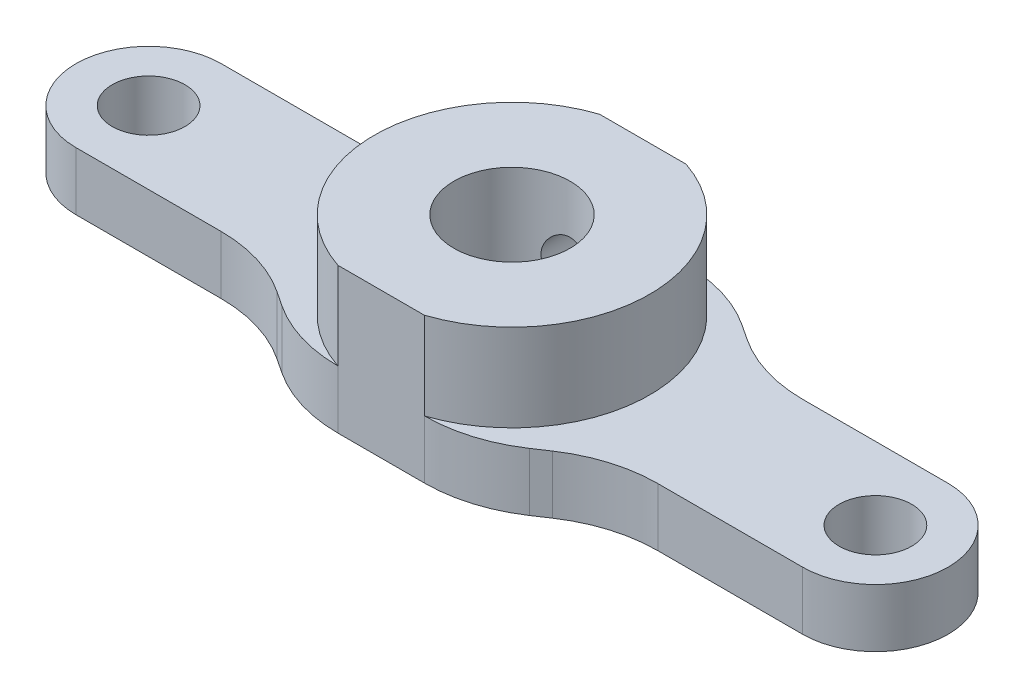
ISO-10303-21;
HEADER;
FILE_DESCRIPTION(('STEP AP214'),'2;1');
FILE_NAME('part.step','',(''),(''),'','','');
FILE_SCHEMA(('AUTOMOTIVE_DESIGN { 1 0 10303 214 1 1 1 1 }'));
ENDSEC;
DATA;
#1=APPLICATION_CONTEXT('core data for automotive mechanical design processes');
#2=APPLICATION_PROTOCOL_DEFINITION('international standard','automotive_design',2000,#1);
#3=PRODUCT_CONTEXT('',#1,'mechanical');
#4=PRODUCT('Part','Part','',(#3));
#5=PRODUCT_RELATED_PRODUCT_CATEGORY('part','',(#4));
#6=PRODUCT_DEFINITION_FORMATION('','',#4);
#7=PRODUCT_DEFINITION_CONTEXT('part definition',#1,'design');
#8=PRODUCT_DEFINITION('design','',#6,#7);
#9=PRODUCT_DEFINITION_SHAPE('','',#8);
#10=(LENGTH_UNIT() NAMED_UNIT(*) SI_UNIT(.MILLI.,.METRE.));
#11=(NAMED_UNIT(*) PLANE_ANGLE_UNIT() SI_UNIT($,.RADIAN.));
#12=(NAMED_UNIT(*) SI_UNIT($,.STERADIAN.) SOLID_ANGLE_UNIT());
#13=UNCERTAINTY_MEASURE_WITH_UNIT(LENGTH_MEASURE(1.E-05),#10,'distance_accuracy_value','');
#14=(GEOMETRIC_REPRESENTATION_CONTEXT(3) GLOBAL_UNCERTAINTY_ASSIGNED_CONTEXT((#13)) GLOBAL_UNIT_ASSIGNED_CONTEXT((#10,
#11,#12)) REPRESENTATION_CONTEXT('',''));
#15=CARTESIAN_POINT('',(0.,0.,0.));
#16=DIRECTION('',(0.,0.,1.));
#17=DIRECTION('',(1.,0.,0.));
#18=AXIS2_PLACEMENT_3D('',#15,#16,#17);
#19=CARTESIAN_POINT('',(0.,4.,0.));
#20=DIRECTION('',(0.,1.,0.));
#21=DIRECTION('',(0.,0.,1.));
#22=AXIS2_PLACEMENT_3D('',#19,#20,#21);
#23=PLANE('',#22);
#24=CARTESIAN_POINT('',(-25.,4.,0.));
#25=DIRECTION('',(0.,1.,0.));
#26=DIRECTION('',(0.,0.,1.));
#27=AXIS2_PLACEMENT_3D('',#24,#25,#26);
#28=CIRCLE('',#27,9.47809222114672);
#29=CARTESIAN_POINT('',(-27.97224362268,4.,-9.));
#30=VERTEX_POINT('',#29);
#31=CARTESIAN_POINT('',(-27.97224362268,4.,9.00000000000001));
#32=VERTEX_POINT('',#31);
#33=EDGE_CURVE('E151',#30,#32,#28,.T.);
#34=ORIENTED_EDGE('',*,*,#33,.F.);
#35=CARTESIAN_POINT('',(-27.9722436226801,4.,1.));
#36=DIRECTION('',(0.,1.,0.));
#37=DIRECTION('',(0.,0.,1.));
#38=AXIS2_PLACEMENT_3D('',#35,#36,#37);
#39=CIRCLE('',#38,10.);
#40=CARTESIAN_POINT('',(-33.5192455849324,4.,-7.32050294337842));
#41=VERTEX_POINT('',#40);
#42=EDGE_CURVE('E327',#30,#41,#39,.T.);
#43=ORIENTED_EDGE('',*,*,#42,.T.);
#44=DIRECTION('',(-0.832050294337843,0.,0.55470019622523));
#45=VECTOR('',#44,1.);
#46=CARTESIAN_POINT('',(-13.6923076923077,4.,-20.5384615384615));
#47=LINE('',#46,#45);
#48=CARTESIAN_POINT('',(-34.4807544150676,4.,-6.67949705662159));
#49=VERTEX_POINT('',#48);
#50=EDGE_CURVE('E390',#41,#49,#47,.T.);
#51=ORIENTED_EDGE('',*,*,#50,.T.);
#52=CARTESIAN_POINT('',(-40.0277563773199,4.,-15.));
#53=DIRECTION('',(0.,1.,0.));
#54=DIRECTION('',(0.,0.,1.));
#55=AXIS2_PLACEMENT_3D('',#52,#53,#54);
#56=CIRCLE('',#55,10.);
#57=CARTESIAN_POINT('',(-40.0277563773199,4.,-4.99999999999999));
#58=VERTEX_POINT('',#57);
#59=EDGE_CURVE('E411',#49,#58,#56,.F.);
#60=ORIENTED_EDGE('',*,*,#59,.T.);
#61=DIRECTION('',(-1.,0.,0.));
#62=VECTOR('',#61,1.);
#63=CARTESIAN_POINT('',(0.,4.,-5.));
#64=LINE('',#63,#62);
#65=CARTESIAN_POINT('',(-50.,4.,-4.99999999999999));
#66=VERTEX_POINT('',#65);
#67=EDGE_CURVE('E217',#58,#66,#64,.T.);
#68=ORIENTED_EDGE('',*,*,#67,.T.);
#69=CARTESIAN_POINT('',(-50.,4.,0.));
#70=DIRECTION('',(0.,1.,0.));
#71=DIRECTION('',(0.,0.,1.));
#72=AXIS2_PLACEMENT_3D('',#69,#70,#71);
#73=CIRCLE('',#72,5.);
#74=CARTESIAN_POINT('',(-50.,4.,5.00000000000001));
#75=VERTEX_POINT('',#74);
#76=EDGE_CURVE('E410',#66,#75,#73,.T.);
#77=ORIENTED_EDGE('',*,*,#76,.T.);
#78=DIRECTION('',(-1.,0.,0.));
#79=VECTOR('',#78,1.);
#80=CARTESIAN_POINT('',(0.,4.,5.));
#81=LINE('',#80,#79);
#82=CARTESIAN_POINT('',(-40.0277563773199,4.,5.00000000000001));
#83=VERTEX_POINT('',#82);
#84=EDGE_CURVE('E415',#83,#75,#81,.T.);
#85=ORIENTED_EDGE('',*,*,#84,.F.);
#86=CARTESIAN_POINT('',(-40.0277563773199,4.,15.));
#87=DIRECTION('',(0.,1.,0.));
#88=DIRECTION('',(0.,0.,1.));
#89=AXIS2_PLACEMENT_3D('',#86,#87,#88);
#90=CIRCLE('',#89,10.);
#91=CARTESIAN_POINT('',(-34.4807544150676,4.,6.67949705662159));
#92=VERTEX_POINT('',#91);
#93=EDGE_CURVE('E423',#92,#83,#90,.T.);
#94=ORIENTED_EDGE('',*,*,#93,.F.);
#95=DIRECTION('',(-0.832050294337843,0.,-0.55470019622523));
#96=VECTOR('',#95,1.);
#97=CARTESIAN_POINT('',(-13.6923076923077,4.,20.5384615384615));
#98=LINE('',#97,#96);
#99=CARTESIAN_POINT('',(-33.5192455849323,4.,7.32050294337843));
#100=VERTEX_POINT('',#99);
#101=EDGE_CURVE('E428',#100,#92,#98,.T.);
#102=ORIENTED_EDGE('',*,*,#101,.F.);
#103=CARTESIAN_POINT('',(-27.97224362268,4.,-0.999999999999997));
#104=DIRECTION('',(0.,1.,0.));
#105=DIRECTION('',(0.,0.,1.));
#106=AXIS2_PLACEMENT_3D('',#103,#104,#105);
#107=CIRCLE('',#106,10.);
#108=EDGE_CURVE('E432',#32,#100,#107,.F.);
#109=ORIENTED_EDGE('',*,*,#108,.F.);
#110=EDGE_LOOP('',(#34,#43,#51,#60,#68,#77,#85,#94,#102,#109));
#111=FACE_BOUND('',#110,.T.);
#112=CARTESIAN_POINT('',(-50.,4.,0.));
#113=DIRECTION('',(0.,1.,0.));
#114=DIRECTION('',(0.,0.,1.));
#115=AXIS2_PLACEMENT_3D('',#112,#113,#114);
#116=CIRCLE('',#115,2.5);
#117=CARTESIAN_POINT('',(-50.,4.,2.50000000000001));
#118=VERTEX_POINT('',#117);
#119=EDGE_CURVE('E243',#118,#118,#116,.T.);
#120=ORIENTED_EDGE('',*,*,#119,.F.);
#121=EDGE_LOOP('',(#120));
#122=FACE_BOUND('',#121,.T.);
#123=ADVANCED_FACE('F48',(#111,#122),#23,.T.);
#124=CARTESIAN_POINT('',(0.,4.,-9.));
#125=DIRECTION('',(0.,0.,-1.));
#126=DIRECTION('',(-1.,0.,0.));
#127=AXIS2_PLACEMENT_3D('',#124,#125,#126);
#128=PLANE('',#127);
#129=CARTESIAN_POINT('',(-25.,5.,-9.));
#130=DIRECTION('',(0.,0.,-1.));
#131=DIRECTION('',(-1.,0.,0.));
#132=AXIS2_PLACEMENT_3D('',#129,#130,#131);
#133=CIRCLE('',#132,1.65);
#134=CARTESIAN_POINT('',(-26.65,5.,-9.));
#135=VERTEX_POINT('',#134);
#136=EDGE_CURVE('E532',#135,#135,#133,.T.);
#137=ORIENTED_EDGE('',*,*,#136,.F.);
#138=EDGE_LOOP('',(#137));
#139=FACE_BOUND('',#138,.T.);
#140=DIRECTION('',(1.,0.,0.));
#141=VECTOR('',#140,1.);
#142=CARTESIAN_POINT('',(0.,0.,-9.));
#143=LINE('',#142,#141);
#144=CARTESIAN_POINT('',(-27.97224362268,0.,-9.));
#145=VERTEX_POINT('',#144);
#146=CARTESIAN_POINT('',(-22.02775637732,0.,-9.));
#147=VERTEX_POINT('',#146);
#148=EDGE_CURVE('E251',#145,#147,#143,.T.);
#149=ORIENTED_EDGE('',*,*,#148,.F.);
#150=DIRECTION('',(0.,-1.,0.));
#151=VECTOR('',#150,1.);
#152=CARTESIAN_POINT('',(-27.97224362268,4.,-9.));
#153=LINE('',#152,#151);
#154=EDGE_CURVE('E11',#30,#145,#153,.T.);
#155=ORIENTED_EDGE('',*,*,#154,.F.);
#156=DIRECTION('',(0.,-1.,0.));
#157=VECTOR('',#156,1.);
#158=CARTESIAN_POINT('',(-27.97224362268,10.,-9.));
#159=LINE('',#158,#157);
#160=CARTESIAN_POINT('',(-27.97224362268,10.,-9.));
#161=VERTEX_POINT('',#160);
#162=EDGE_CURVE('E487',#161,#30,#159,.T.);
#163=ORIENTED_EDGE('',*,*,#162,.F.);
#164=DIRECTION('',(-1.,0.,0.));
#165=VECTOR('',#164,1.);
#166=CARTESIAN_POINT('',(0.,10.,-9.));
#167=LINE('',#166,#165);
#168=CARTESIAN_POINT('',(-22.02775637732,10.,-9.));
#169=VERTEX_POINT('',#168);
#170=EDGE_CURVE('E502',#169,#161,#167,.T.);
#171=ORIENTED_EDGE('',*,*,#170,.F.);
#172=DIRECTION('',(0.,-1.,0.));
#173=VECTOR('',#172,1.);
#174=CARTESIAN_POINT('',(-22.02775637732,10.,-9.));
#175=LINE('',#174,#173);
#176=CARTESIAN_POINT('',(-22.02775637732,4.,-9.));
#177=VERTEX_POINT('',#176);
#178=EDGE_CURVE('E483',#169,#177,#175,.T.);
#179=ORIENTED_EDGE('',*,*,#178,.T.);
#180=DIRECTION('',(0.,-1.,0.));
#181=VECTOR('',#180,1.);
#182=CARTESIAN_POINT('',(-22.02775637732,4.,-9.));
#183=LINE('',#182,#181);
#184=EDGE_CURVE('E142',#177,#147,#183,.T.);
#185=ORIENTED_EDGE('',*,*,#184,.T.);
#186=EDGE_LOOP('',(#149,#155,#163,#171,#179,#185));
#187=FACE_BOUND('',#186,.T.);
#188=ADVANCED_FACE('F50',(#139,#187),#128,.T.);
#189=CARTESIAN_POINT('',(-27.9722436226801,4.,1.));
#190=DIRECTION('',(0.,-1.,0.));
#191=DIRECTION('',(0.,0.,-1.));
#192=AXIS2_PLACEMENT_3D('',#189,#190,#191);
#193=CYLINDRICAL_SURFACE('',#192,10.);
#194=CARTESIAN_POINT('',(-27.9722436226801,0.,1.));
#195=DIRECTION('',(0.,1.,0.));
#196=DIRECTION('',(0.,0.,1.));
#197=AXIS2_PLACEMENT_3D('',#194,#195,#196);
#198=CIRCLE('',#197,10.);
#199=CARTESIAN_POINT('',(-33.5192455849324,0.,-7.32050294337842));
#200=VERTEX_POINT('',#199);
#201=EDGE_CURVE('E254',#145,#200,#198,.T.);
#202=ORIENTED_EDGE('',*,*,#201,.T.);
#203=DIRECTION('',(0.,-1.,0.));
#204=VECTOR('',#203,1.);
#205=CARTESIAN_POINT('',(-33.5192455849324,4.,-7.32050294337842));
#206=LINE('',#205,#204);
#207=EDGE_CURVE('E64',#41,#200,#206,.T.);
#208=ORIENTED_EDGE('',*,*,#207,.F.);
#209=ORIENTED_EDGE('',*,*,#42,.F.);
#210=ORIENTED_EDGE('',*,*,#154,.T.);
#211=EDGE_LOOP('',(#202,#208,#209,#210));
#212=FACE_BOUND('',#211,.T.);
#213=ADVANCED_FACE('F543',(#212),#193,.T.);
#214=CARTESIAN_POINT('',(-13.6923076923077,4.,-20.5384615384615));
#215=DIRECTION('',(0.55470019622523,0.,0.832050294337843));
#216=DIRECTION('',(0.832050294337843,0.,-0.55470019622523));
#217=AXIS2_PLACEMENT_3D('',#214,#215,#216);
#218=PLANE('',#217);
#219=DIRECTION('',(-0.832050294337843,0.,0.55470019622523));
#220=VECTOR('',#219,1.);
#221=CARTESIAN_POINT('',(-13.6923076923077,0.,-20.5384615384615));
#222=LINE('',#221,#220);
#223=CARTESIAN_POINT('',(-34.4807544150676,0.,-6.67949705662159));
#224=VERTEX_POINT('',#223);
#225=EDGE_CURVE('E258',#200,#224,#222,.T.);
#226=ORIENTED_EDGE('',*,*,#225,.T.);
#227=DIRECTION('',(0.,-1.,0.));
#228=VECTOR('',#227,1.);
#229=CARTESIAN_POINT('',(-34.4807544150676,4.,-6.67949705662159));
#230=LINE('',#229,#228);
#231=EDGE_CURVE('E377',#49,#224,#230,.T.);
#232=ORIENTED_EDGE('',*,*,#231,.F.);
#233=ORIENTED_EDGE('',*,*,#50,.F.);
#234=ORIENTED_EDGE('',*,*,#207,.T.);
#235=EDGE_LOOP('',(#226,#232,#233,#234));
#236=FACE_BOUND('',#235,.T.);
#237=ADVANCED_FACE('F388',(#236),#218,.F.);
#238=CARTESIAN_POINT('',(-40.0277563773199,4.,-15.));
#239=DIRECTION('',(0.,-1.,0.));
#240=DIRECTION('',(0.,0.,-1.));
#241=AXIS2_PLACEMENT_3D('',#238,#239,#240);
#242=CYLINDRICAL_SURFACE('',#241,10.);
#243=CARTESIAN_POINT('',(-40.0277563773199,0.,-15.));
#244=DIRECTION('',(0.,1.,0.));
#245=DIRECTION('',(0.,0.,1.));
#246=AXIS2_PLACEMENT_3D('',#243,#244,#245);
#247=CIRCLE('',#246,10.);
#248=CARTESIAN_POINT('',(-40.0277563773199,0.,-4.99999999999999));
#249=VERTEX_POINT('',#248);
#250=EDGE_CURVE('E261',#224,#249,#247,.F.);
#251=ORIENTED_EDGE('',*,*,#250,.T.);
#252=DIRECTION('',(0.,-1.,0.));
#253=VECTOR('',#252,1.);
#254=CARTESIAN_POINT('',(-40.0277563773199,4.,-4.99999999999999));
#255=LINE('',#254,#253);
#256=EDGE_CURVE('E373',#58,#249,#255,.T.);
#257=ORIENTED_EDGE('',*,*,#256,.F.);
#258=ORIENTED_EDGE('',*,*,#59,.F.);
#259=ORIENTED_EDGE('',*,*,#231,.T.);
#260=EDGE_LOOP('',(#251,#257,#258,#259));
#261=FACE_BOUND('',#260,.T.);
#262=ADVANCED_FACE('F402',(#261),#242,.F.);
#263=CARTESIAN_POINT('',(0.,4.,-5.));
#264=DIRECTION('',(0.,0.,1.));
#265=DIRECTION('',(1.,0.,0.));
#266=AXIS2_PLACEMENT_3D('',#263,#264,#265);
#267=PLANE('',#266);
#268=DIRECTION('',(-1.,0.,0.));
#269=VECTOR('',#268,1.);
#270=CARTESIAN_POINT('',(0.,0.,-5.));
#271=LINE('',#270,#269);
#272=CARTESIAN_POINT('',(-50.,0.,-4.99999999999999));
#273=VERTEX_POINT('',#272);
#274=EDGE_CURVE('E264',#249,#273,#271,.T.);
#275=ORIENTED_EDGE('',*,*,#274,.T.);
#276=DIRECTION('',(0.,-1.,0.));
#277=VECTOR('',#276,1.);
#278=CARTESIAN_POINT('',(-50.,4.,-4.99999999999999));
#279=LINE('',#278,#277);
#280=EDGE_CURVE('E369',#66,#273,#279,.T.);
#281=ORIENTED_EDGE('',*,*,#280,.F.);
#282=ORIENTED_EDGE('',*,*,#67,.F.);
#283=ORIENTED_EDGE('',*,*,#256,.T.);
#284=EDGE_LOOP('',(#275,#281,#282,#283));
#285=FACE_BOUND('',#284,.T.);
#286=ADVANCED_FACE('F406',(#285),#267,.F.);
#287=CARTESIAN_POINT('',(-50.,4.,0.));
#288=DIRECTION('',(0.,-1.,0.));
#289=DIRECTION('',(0.,0.,-1.));
#290=AXIS2_PLACEMENT_3D('',#287,#288,#289);
#291=CYLINDRICAL_SURFACE('',#290,5.);
#292=CARTESIAN_POINT('',(-50.,0.,0.));
#293=DIRECTION('',(0.,1.,0.));
#294=DIRECTION('',(0.,0.,1.));
#295=AXIS2_PLACEMENT_3D('',#292,#293,#294);
#296=CIRCLE('',#295,5.);
#297=CARTESIAN_POINT('',(-50.,0.,5.00000000000001));
#298=VERTEX_POINT('',#297);
#299=EDGE_CURVE('E267',#273,#298,#296,.T.);
#300=ORIENTED_EDGE('',*,*,#299,.T.);
#301=DIRECTION('',(0.,-1.,0.));
#302=VECTOR('',#301,1.);
#303=CARTESIAN_POINT('',(-50.,4.,5.00000000000001));
#304=LINE('',#303,#302);
#305=EDGE_CURVE('E366',#75,#298,#304,.T.);
#306=ORIENTED_EDGE('',*,*,#305,.F.);
#307=ORIENTED_EDGE('',*,*,#76,.F.);
#308=ORIENTED_EDGE('',*,*,#280,.T.);
#309=EDGE_LOOP('',(#300,#306,#307,#308));
#310=FACE_BOUND('',#309,.T.);
#311=ADVANCED_FACE('F599',(#310),#291,.T.);
#312=CARTESIAN_POINT('',(0.,4.,5.));
#313=DIRECTION('',(0.,0.,1.));
#314=DIRECTION('',(1.,0.,0.));
#315=AXIS2_PLACEMENT_3D('',#312,#313,#314);
#316=PLANE('',#315);
#317=DIRECTION('',(-1.,0.,0.));
#318=VECTOR('',#317,1.);
#319=CARTESIAN_POINT('',(0.,0.,5.));
#320=LINE('',#319,#318);
#321=CARTESIAN_POINT('',(-40.0277563773199,0.,5.00000000000001));
#322=VERTEX_POINT('',#321);
#323=EDGE_CURVE('E271',#322,#298,#320,.T.);
#324=ORIENTED_EDGE('',*,*,#323,.F.);
#325=DIRECTION('',(0.,-1.,0.));
#326=VECTOR('',#325,1.);
#327=CARTESIAN_POINT('',(-40.0277563773199,4.,5.00000000000001));
#328=LINE('',#327,#326);
#329=EDGE_CURVE('E363',#83,#322,#328,.T.);
#330=ORIENTED_EDGE('',*,*,#329,.F.);
#331=ORIENTED_EDGE('',*,*,#84,.T.);
#332=ORIENTED_EDGE('',*,*,#305,.T.);
#333=EDGE_LOOP('',(#324,#330,#331,#332));
#334=FACE_BOUND('',#333,.T.);
#335=ADVANCED_FACE('F596',(#334),#316,.T.);
#336=CARTESIAN_POINT('',(-40.0277563773199,4.,15.));
#337=DIRECTION('',(0.,-1.,0.));
#338=DIRECTION('',(0.,0.,-1.));
#339=AXIS2_PLACEMENT_3D('',#336,#337,#338);
#340=CYLINDRICAL_SURFACE('',#339,10.);
#341=CARTESIAN_POINT('',(-40.0277563773199,0.,15.));
#342=DIRECTION('',(0.,1.,0.));
#343=DIRECTION('',(0.,0.,1.));
#344=AXIS2_PLACEMENT_3D('',#341,#342,#343);
#345=CIRCLE('',#344,10.);
#346=CARTESIAN_POINT('',(-34.4807544150676,0.,6.67949705662159));
#347=VERTEX_POINT('',#346);
#348=EDGE_CURVE('E275',#347,#322,#345,.T.);
#349=ORIENTED_EDGE('',*,*,#348,.F.);
#350=DIRECTION('',(0.,-1.,0.));
#351=VECTOR('',#350,1.);
#352=CARTESIAN_POINT('',(-34.4807544150676,4.,6.67949705662159));
#353=LINE('',#352,#351);
#354=EDGE_CURVE('E360',#92,#347,#353,.T.);
#355=ORIENTED_EDGE('',*,*,#354,.F.);
#356=ORIENTED_EDGE('',*,*,#93,.T.);
#357=ORIENTED_EDGE('',*,*,#329,.T.);
#358=EDGE_LOOP('',(#349,#355,#356,#357));
#359=FACE_BOUND('',#358,.T.);
#360=ADVANCED_FACE('F592',(#359),#340,.F.);
#361=CARTESIAN_POINT('',(-13.6923076923077,4.,20.5384615384615));
#362=DIRECTION('',(-0.55470019622523,0.,0.832050294337843));
#363=DIRECTION('',(0.832050294337843,0.,0.55470019622523));
#364=AXIS2_PLACEMENT_3D('',#361,#362,#363);
#365=PLANE('',#364);
#366=DIRECTION('',(-0.832050294337843,0.,-0.55470019622523));
#367=VECTOR('',#366,1.);
#368=CARTESIAN_POINT('',(-13.6923076923077,0.,20.5384615384615));
#369=LINE('',#368,#367);
#370=CARTESIAN_POINT('',(-33.5192455849323,0.,7.32050294337843));
#371=VERTEX_POINT('',#370);
#372=EDGE_CURVE('E280',#371,#347,#369,.T.);
#373=ORIENTED_EDGE('',*,*,#372,.F.);
#374=DIRECTION('',(0.,-1.,0.));
#375=VECTOR('',#374,1.);
#376=CARTESIAN_POINT('',(-33.5192455849323,4.,7.32050294337843));
#377=LINE('',#376,#375);
#378=EDGE_CURVE('E357',#100,#371,#377,.T.);
#379=ORIENTED_EDGE('',*,*,#378,.F.);
#380=ORIENTED_EDGE('',*,*,#101,.T.);
#381=ORIENTED_EDGE('',*,*,#354,.T.);
#382=EDGE_LOOP('',(#373,#379,#380,#381));
#383=FACE_BOUND('',#382,.T.);
#384=ADVANCED_FACE('F588',(#383),#365,.T.);
#385=CARTESIAN_POINT('',(-27.97224362268,4.,-0.999999999999997));
#386=DIRECTION('',(0.,-1.,0.));
#387=DIRECTION('',(0.,0.,-1.));
#388=AXIS2_PLACEMENT_3D('',#385,#386,#387);
#389=CYLINDRICAL_SURFACE('',#388,10.);
#390=CARTESIAN_POINT('',(-27.97224362268,0.,-0.999999999999997));
#391=DIRECTION('',(0.,1.,0.));
#392=DIRECTION('',(0.,0.,1.));
#393=AXIS2_PLACEMENT_3D('',#390,#391,#392);
#394=CIRCLE('',#393,10.);
#395=CARTESIAN_POINT('',(-27.97224362268,0.,9.00000000000001));
#396=VERTEX_POINT('',#395);
#397=EDGE_CURVE('E284',#396,#371,#394,.F.);
#398=ORIENTED_EDGE('',*,*,#397,.F.);
#399=DIRECTION('',(0.,-1.,0.));
#400=VECTOR('',#399,1.);
#401=CARTESIAN_POINT('',(-27.97224362268,4.,9.00000000000001));
#402=LINE('',#401,#400);
#403=EDGE_CURVE('E354',#32,#396,#402,.T.);
#404=ORIENTED_EDGE('',*,*,#403,.F.);
#405=ORIENTED_EDGE('',*,*,#108,.T.);
#406=ORIENTED_EDGE('',*,*,#378,.T.);
#407=EDGE_LOOP('',(#398,#404,#405,#406));
#408=FACE_BOUND('',#407,.T.);
#409=ADVANCED_FACE('F584',(#408),#389,.T.);
#410=CARTESIAN_POINT('',(0.,4.,9.00000000000001));
#411=DIRECTION('',(0.,0.,-1.));
#412=DIRECTION('',(-1.,0.,0.));
#413=AXIS2_PLACEMENT_3D('',#410,#411,#412);
#414=PLANE('',#413);
#415=DIRECTION('',(1.,0.,0.));
#416=VECTOR('',#415,1.);
#417=CARTESIAN_POINT('',(0.,0.,9.00000000000001));
#418=LINE('',#417,#416);
#419=CARTESIAN_POINT('',(-22.02775637732,0.,9.00000000000001));
#420=VERTEX_POINT('',#419);
#421=EDGE_CURVE('E288',#396,#420,#418,.T.);
#422=ORIENTED_EDGE('',*,*,#421,.T.);
#423=DIRECTION('',(0.,-1.,0.));
#424=VECTOR('',#423,1.);
#425=CARTESIAN_POINT('',(-22.02775637732,4.,9.00000000000001));
#426=LINE('',#425,#424);
#427=CARTESIAN_POINT('',(-22.02775637732,4.,9.00000000000001));
#428=VERTEX_POINT('',#427);
#429=EDGE_CURVE('E350',#428,#420,#426,.T.);
#430=ORIENTED_EDGE('',*,*,#429,.F.);
#431=DIRECTION('',(0.,-1.,0.));
#432=VECTOR('',#431,1.);
#433=CARTESIAN_POINT('',(-22.0277563773199,10.,9.00000000000001));
#434=LINE('',#433,#432);
#435=CARTESIAN_POINT('',(-22.0277563773199,10.,9.00000000000001));
#436=VERTEX_POINT('',#435);
#437=EDGE_CURVE('E255',#436,#428,#434,.T.);
#438=ORIENTED_EDGE('',*,*,#437,.F.);
#439=DIRECTION('',(1.,0.,0.));
#440=VECTOR('',#439,1.);
#441=CARTESIAN_POINT('',(0.,10.,9.00000000000001));
#442=LINE('',#441,#440);
#443=CARTESIAN_POINT('',(-27.97224362268,10.,9.00000000000001));
#444=VERTEX_POINT('',#443);
#445=EDGE_CURVE('E512',#444,#436,#442,.T.);
#446=ORIENTED_EDGE('',*,*,#445,.F.);
#447=DIRECTION('',(0.,-1.,0.));
#448=VECTOR('',#447,1.);
#449=CARTESIAN_POINT('',(-27.97224362268,10.,9.00000000000001));
#450=LINE('',#449,#448);
#451=EDGE_CURVE('E492',#444,#32,#450,.T.);
#452=ORIENTED_EDGE('',*,*,#451,.T.);
#453=ORIENTED_EDGE('',*,*,#403,.T.);
#454=EDGE_LOOP('',(#422,#430,#438,#446,#452,#453));
#455=FACE_BOUND('',#454,.T.);
#456=ADVANCED_FACE('F567',(#455),#414,.F.);
#457=CARTESIAN_POINT('',(-22.0277563773199,4.,-0.999999999999998));
#458=DIRECTION('',(0.,-1.,0.));
#459=DIRECTION('',(0.,0.,-1.));
#460=AXIS2_PLACEMENT_3D('',#457,#458,#459);
#461=CYLINDRICAL_SURFACE('',#460,10.);
#462=CARTESIAN_POINT('',(-22.0277563773199,0.,-0.999999999999998));
#463=DIRECTION('',(0.,1.,0.));
#464=DIRECTION('',(0.,0.,1.));
#465=AXIS2_PLACEMENT_3D('',#462,#463,#464);
#466=CIRCLE('',#465,10.);
#467=CARTESIAN_POINT('',(-16.4807544150676,0.,7.32050294337842));
#468=VERTEX_POINT('',#467);
#469=EDGE_CURVE('E291',#420,#468,#466,.T.);
#470=ORIENTED_EDGE('',*,*,#469,.T.);
#471=DIRECTION('',(0.,-1.,0.));
#472=VECTOR('',#471,1.);
#473=CARTESIAN_POINT('',(-16.4807544150676,4.,7.32050294337842));
#474=LINE('',#473,#472);
#475=CARTESIAN_POINT('',(-16.4807544150676,4.,7.32050294337842));
#476=VERTEX_POINT('',#475);
#477=EDGE_CURVE('E346',#476,#468,#474,.T.);
#478=ORIENTED_EDGE('',*,*,#477,.F.);
#479=CARTESIAN_POINT('',(-22.0277563773199,4.,-0.999999999999998));
#480=DIRECTION('',(0.,1.,0.));
#481=DIRECTION('',(0.,0.,1.));
#482=AXIS2_PLACEMENT_3D('',#479,#480,#481);
#483=CIRCLE('',#482,10.);
#484=EDGE_CURVE('E436',#428,#476,#483,.T.);
#485=ORIENTED_EDGE('',*,*,#484,.F.);
#486=ORIENTED_EDGE('',*,*,#429,.T.);
#487=EDGE_LOOP('',(#470,#478,#485,#486));
#488=FACE_BOUND('',#487,.T.);
#489=ADVANCED_FACE('F573',(#488),#461,.T.);
#490=CARTESIAN_POINT('',(-1.69230769230769,4.,-2.53846153846153));
#491=DIRECTION('',(-0.554700196225229,0.,-0.832050294337844));
#492=DIRECTION('',(-0.832050294337844,0.,0.554700196225229));
#493=AXIS2_PLACEMENT_3D('',#490,#491,#492);
#494=PLANE('',#493);
#495=DIRECTION('',(0.832050294337844,0.,-0.554700196225229));
#496=VECTOR('',#495,1.);
#497=CARTESIAN_POINT('',(-1.69230769230769,0.,-2.53846153846153));
#498=LINE('',#497,#496);
#499=CARTESIAN_POINT('',(-15.5192455849324,0.,6.67949705662159));
#500=VERTEX_POINT('',#499);
#501=EDGE_CURVE('E294',#468,#500,#498,.T.);
#502=ORIENTED_EDGE('',*,*,#501,.T.);
#503=DIRECTION('',(0.,-1.,0.));
#504=VECTOR('',#503,1.);
#505=CARTESIAN_POINT('',(-15.5192455849324,4.,6.67949705662159));
#506=LINE('',#505,#504);
#507=CARTESIAN_POINT('',(-15.5192455849324,4.,6.67949705662159));
#508=VERTEX_POINT('',#507);
#509=EDGE_CURVE('E342',#508,#500,#506,.T.);
#510=ORIENTED_EDGE('',*,*,#509,.F.);
#511=DIRECTION('',(0.832050294337844,0.,-0.554700196225229));
#512=VECTOR('',#511,1.);
#513=CARTESIAN_POINT('',(-1.69230769230769,4.,-2.53846153846153));
#514=LINE('',#513,#512);
#515=EDGE_CURVE('E439',#476,#508,#514,.T.);
#516=ORIENTED_EDGE('',*,*,#515,.F.);
#517=ORIENTED_EDGE('',*,*,#477,.T.);
#518=EDGE_LOOP('',(#502,#510,#516,#517));
#519=FACE_BOUND('',#518,.T.);
#520=ADVANCED_FACE('F577',(#519),#494,.F.);
#521=CARTESIAN_POINT('',(-9.97224362268005,4.,15.));
#522=DIRECTION('',(0.,-1.,0.));
#523=DIRECTION('',(0.,0.,-1.));
#524=AXIS2_PLACEMENT_3D('',#521,#522,#523);
#525=CYLINDRICAL_SURFACE('',#524,10.);
#526=CARTESIAN_POINT('',(-9.97224362268005,0.,15.));
#527=DIRECTION('',(0.,1.,0.));
#528=DIRECTION('',(0.,0.,1.));
#529=AXIS2_PLACEMENT_3D('',#526,#527,#528);
#530=CIRCLE('',#529,10.);
#531=CARTESIAN_POINT('',(-9.97224362268005,0.,5.));
#532=VERTEX_POINT('',#531);
#533=EDGE_CURVE('E297',#500,#532,#530,.F.);
#534=ORIENTED_EDGE('',*,*,#533,.T.);
#535=DIRECTION('',(0.,-1.,0.));
#536=VECTOR('',#535,1.);
#537=CARTESIAN_POINT('',(-9.97224362268005,4.,5.));
#538=LINE('',#537,#536);
#539=CARTESIAN_POINT('',(-9.97224362268005,4.,5.));
#540=VERTEX_POINT('',#539);
#541=EDGE_CURVE('E339',#540,#532,#538,.T.);
#542=ORIENTED_EDGE('',*,*,#541,.F.);
#543=CARTESIAN_POINT('',(-9.97224362268005,4.,15.));
#544=DIRECTION('',(0.,1.,0.));
#545=DIRECTION('',(0.,0.,1.));
#546=AXIS2_PLACEMENT_3D('',#543,#544,#545);
#547=CIRCLE('',#546,10.);
#548=EDGE_CURVE('E441',#508,#540,#547,.F.);
#549=ORIENTED_EDGE('',*,*,#548,.F.);
#550=ORIENTED_EDGE('',*,*,#509,.T.);
#551=EDGE_LOOP('',(#534,#542,#549,#550));
#552=FACE_BOUND('',#551,.T.);
#553=ADVANCED_FACE('F581',(#552),#525,.F.);
#554=CARTESIAN_POINT('',(0.,0.,5.));
#555=VERTEX_POINT('',#554);
#556=EDGE_CURVE('E276',#555,#532,#320,.T.);
#557=ORIENTED_EDGE('',*,*,#556,.F.);
#558=DIRECTION('',(0.,-1.,0.));
#559=VECTOR('',#558,1.);
#560=CARTESIAN_POINT('',(0.,4.,5.));
#561=LINE('',#560,#559);
#562=CARTESIAN_POINT('',(0.,4.,5.));
#563=VERTEX_POINT('',#562);
#564=EDGE_CURVE('E336',#563,#555,#561,.T.);
#565=ORIENTED_EDGE('',*,*,#564,.F.);
#566=EDGE_CURVE('E424',#563,#540,#81,.T.);
#567=ORIENTED_EDGE('',*,*,#566,.T.);
#568=ORIENTED_EDGE('',*,*,#541,.T.);
#569=EDGE_LOOP('',(#557,#565,#567,#568));
#570=FACE_BOUND('',#569,.T.);
#571=ADVANCED_FACE('F454',(#570),#316,.T.);
#572=CARTESIAN_POINT('',(0.,4.,0.));
#573=DIRECTION('',(0.,-1.,0.));
#574=DIRECTION('',(0.,0.,-1.));
#575=AXIS2_PLACEMENT_3D('',#572,#573,#574);
#576=CYLINDRICAL_SURFACE('',#575,5.);
#577=CARTESIAN_POINT('',(0.,0.,0.));
#578=DIRECTION('',(0.,1.,0.));
#579=DIRECTION('',(0.,0.,1.));
#580=AXIS2_PLACEMENT_3D('',#577,#578,#579);
#581=CIRCLE('',#580,5.);
#582=CARTESIAN_POINT('',(0.,0.,-5.));
#583=VERTEX_POINT('',#582);
#584=EDGE_CURVE('E301',#555,#583,#581,.T.);
#585=ORIENTED_EDGE('',*,*,#584,.T.);
#586=DIRECTION('',(0.,-1.,0.));
#587=VECTOR('',#586,1.);
#588=CARTESIAN_POINT('',(0.,4.,-5.));
#589=LINE('',#588,#587);
#590=CARTESIAN_POINT('',(0.,4.,-5.));
#591=VERTEX_POINT('',#590);
#592=EDGE_CURVE('E227',#591,#583,#589,.T.);
#593=ORIENTED_EDGE('',*,*,#592,.F.);
#594=CARTESIAN_POINT('',(0.,4.,0.));
#595=DIRECTION('',(0.,1.,0.));
#596=DIRECTION('',(0.,0.,1.));
#597=AXIS2_PLACEMENT_3D('',#594,#595,#596);
#598=CIRCLE('',#597,5.);
#599=EDGE_CURVE('E211',#563,#591,#598,.T.);
#600=ORIENTED_EDGE('',*,*,#599,.F.);
#601=ORIENTED_EDGE('',*,*,#564,.T.);
#602=EDGE_LOOP('',(#585,#593,#600,#601));
#603=FACE_BOUND('',#602,.T.);
#604=ADVANCED_FACE('F458',(#603),#576,.T.);
#605=CARTESIAN_POINT('',(-9.97224362268002,0.,-5.));
#606=VERTEX_POINT('',#605);
#607=EDGE_CURVE('E222',#583,#606,#271,.T.);
#608=ORIENTED_EDGE('',*,*,#607,.T.);
#609=DIRECTION('',(0.,-1.,0.));
#610=VECTOR('',#609,1.);
#611=CARTESIAN_POINT('',(-9.97224362268002,4.,-5.));
#612=LINE('',#611,#610);
#613=CARTESIAN_POINT('',(-9.97224362268002,4.,-5.));
#614=VERTEX_POINT('',#613);
#615=EDGE_CURVE('E219',#614,#606,#612,.T.);
#616=ORIENTED_EDGE('',*,*,#615,.F.);
#617=EDGE_CURVE('E203',#591,#614,#64,.T.);
#618=ORIENTED_EDGE('',*,*,#617,.F.);
#619=ORIENTED_EDGE('',*,*,#592,.T.);
#620=EDGE_LOOP('',(#608,#616,#618,#619));
#621=FACE_BOUND('',#620,.T.);
#622=ADVANCED_FACE('F220',(#621),#267,.F.);
#623=CARTESIAN_POINT('',(-9.97224362268006,4.,-15.));
#624=DIRECTION('',(0.,-1.,0.));
#625=DIRECTION('',(0.,0.,-1.));
#626=AXIS2_PLACEMENT_3D('',#623,#624,#625);
#627=CYLINDRICAL_SURFACE('',#626,10.);
#628=CARTESIAN_POINT('',(-9.97224362268006,0.,-15.));
#629=DIRECTION('',(0.,1.,0.));
#630=DIRECTION('',(0.,0.,1.));
#631=AXIS2_PLACEMENT_3D('',#628,#629,#630);
#632=CIRCLE('',#631,10.);
#633=CARTESIAN_POINT('',(-15.5192455849324,0.,-6.67949705662158));
#634=VERTEX_POINT('',#633);
#635=EDGE_CURVE('E304',#634,#606,#632,.T.);
#636=ORIENTED_EDGE('',*,*,#635,.F.);
#637=DIRECTION('',(0.,-1.,0.));
#638=VECTOR('',#637,1.);
#639=CARTESIAN_POINT('',(-15.5192455849324,4.,-6.67949705662158));
#640=LINE('',#639,#638);
#641=CARTESIAN_POINT('',(-15.5192455849324,4.,-6.67949705662158));
#642=VERTEX_POINT('',#641);
#643=EDGE_CURVE('E228',#642,#634,#640,.T.);
#644=ORIENTED_EDGE('',*,*,#643,.F.);
#645=CARTESIAN_POINT('',(-9.97224362268006,4.,-15.));
#646=DIRECTION('',(0.,1.,0.));
#647=DIRECTION('',(0.,0.,1.));
#648=AXIS2_PLACEMENT_3D('',#645,#646,#647);
#649=CIRCLE('',#648,10.);
#650=EDGE_CURVE('E208',#642,#614,#649,.T.);
#651=ORIENTED_EDGE('',*,*,#650,.T.);
#652=ORIENTED_EDGE('',*,*,#615,.T.);
#653=EDGE_LOOP('',(#636,#644,#651,#652));
#654=FACE_BOUND('',#653,.T.);
#655=ADVANCED_FACE('F230',(#654),#627,.F.);
#656=CARTESIAN_POINT('',(-1.69230769230769,4.,2.53846153846154));
#657=DIRECTION('',(0.554700196225229,0.,-0.832050294337844));
#658=DIRECTION('',(-0.832050294337844,0.,-0.554700196225229));
#659=AXIS2_PLACEMENT_3D('',#656,#657,#658);
#660=PLANE('',#659);
#661=DIRECTION('',(0.832050294337844,0.,0.554700196225229));
#662=VECTOR('',#661,1.);
#663=CARTESIAN_POINT('',(-1.69230769230769,0.,2.53846153846154));
#664=LINE('',#663,#662);
#665=CARTESIAN_POINT('',(-16.4807544150676,0.,-7.32050294337841));
#666=VERTEX_POINT('',#665);
#667=EDGE_CURVE('E307',#666,#634,#664,.T.);
#668=ORIENTED_EDGE('',*,*,#667,.F.);
#669=DIRECTION('',(0.,-1.,0.));
#670=VECTOR('',#669,1.);
#671=CARTESIAN_POINT('',(-16.4807544150676,4.,-7.32050294337841));
#672=LINE('',#671,#670);
#673=CARTESIAN_POINT('',(-16.4807544150676,4.,-7.32050294337841));
#674=VERTEX_POINT('',#673);
#675=EDGE_CURVE('E72',#674,#666,#672,.T.);
#676=ORIENTED_EDGE('',*,*,#675,.F.);
#677=DIRECTION('',(0.832050294337844,0.,0.554700196225229));
#678=VECTOR('',#677,1.);
#679=CARTESIAN_POINT('',(-1.69230769230769,4.,2.53846153846154));
#680=LINE('',#679,#678);
#681=EDGE_CURVE('E232',#674,#642,#680,.T.);
#682=ORIENTED_EDGE('',*,*,#681,.T.);
#683=ORIENTED_EDGE('',*,*,#643,.T.);
#684=EDGE_LOOP('',(#668,#676,#682,#683));
#685=FACE_BOUND('',#684,.T.);
#686=ADVANCED_FACE('F637',(#685),#660,.T.);
#687=CARTESIAN_POINT('',(0.,4.,0.));
#688=DIRECTION('',(0.,-1.,0.));
#689=DIRECTION('',(0.,0.,-1.));
#690=AXIS2_PLACEMENT_3D('',#687,#688,#689);
#691=CYLINDRICAL_SURFACE('',#690,2.5);
#692=CARTESIAN_POINT('',(0.,4.,0.));
#693=DIRECTION('',(0.,1.,0.));
#694=DIRECTION('',(0.,0.,1.));
#695=AXIS2_PLACEMENT_3D('',#692,#693,#694);
#696=CIRCLE('',#695,2.5);
#697=CARTESIAN_POINT('',(0.,4.,2.5));
#698=VERTEX_POINT('',#697);
#699=EDGE_CURVE('E247',#698,#698,#696,.F.);
#700=ORIENTED_EDGE('',*,*,#699,.F.);
#701=EDGE_LOOP('',(#700));
#702=FACE_BOUND('',#701,.T.);
#703=CARTESIAN_POINT('',(0.,0.,0.));
#704=DIRECTION('',(0.,1.,0.));
#705=DIRECTION('',(0.,0.,1.));
#706=AXIS2_PLACEMENT_3D('',#703,#704,#705);
#707=CIRCLE('',#706,2.5);
#708=CARTESIAN_POINT('',(0.,0.,2.5));
#709=VERTEX_POINT('',#708);
#710=EDGE_CURVE('E319',#709,#709,#707,.F.);
#711=ORIENTED_EDGE('',*,*,#710,.T.);
#712=EDGE_LOOP('',(#711));
#713=FACE_BOUND('',#712,.T.);
#714=ADVANCED_FACE('F634',(#702,#713),#691,.F.);
#715=CARTESIAN_POINT('',(-50.,4.,0.));
#716=DIRECTION('',(0.,-1.,0.));
#717=DIRECTION('',(0.,0.,-1.));
#718=AXIS2_PLACEMENT_3D('',#715,#716,#717);
#719=CYLINDRICAL_SURFACE('',#718,2.5);
#720=ORIENTED_EDGE('',*,*,#119,.T.);
#721=EDGE_LOOP('',(#720));
#722=FACE_BOUND('',#721,.T.);
#723=CARTESIAN_POINT('',(-50.,0.,0.));
#724=DIRECTION('',(0.,1.,0.));
#725=DIRECTION('',(0.,0.,1.));
#726=AXIS2_PLACEMENT_3D('',#723,#724,#725);
#727=CIRCLE('',#726,2.5);
#728=CARTESIAN_POINT('',(-50.,0.,2.50000000000001));
#729=VERTEX_POINT('',#728);
#730=EDGE_CURVE('E315',#729,#729,#727,.T.);
#731=ORIENTED_EDGE('',*,*,#730,.F.);
#732=EDGE_LOOP('',(#731));
#733=FACE_BOUND('',#732,.T.);
#734=ADVANCED_FACE('F628',(#722,#733),#719,.F.);
#735=CARTESIAN_POINT('',(-22.0277563773199,4.,1.));
#736=DIRECTION('',(0.,-1.,0.));
#737=DIRECTION('',(0.,0.,-1.));
#738=AXIS2_PLACEMENT_3D('',#735,#736,#737);
#739=CYLINDRICAL_SURFACE('',#738,10.);
#740=CARTESIAN_POINT('',(-22.0277563773199,0.,1.));
#741=DIRECTION('',(0.,1.,0.));
#742=DIRECTION('',(0.,0.,1.));
#743=AXIS2_PLACEMENT_3D('',#740,#741,#742);
#744=CIRCLE('',#743,10.);
#745=EDGE_CURVE('E311',#147,#666,#744,.F.);
#746=ORIENTED_EDGE('',*,*,#745,.F.);
#747=ORIENTED_EDGE('',*,*,#184,.F.);
#748=CARTESIAN_POINT('',(-22.0277563773199,4.,1.));
#749=DIRECTION('',(0.,1.,0.));
#750=DIRECTION('',(0.,0.,1.));
#751=AXIS2_PLACEMENT_3D('',#748,#749,#750);
#752=CIRCLE('',#751,10.);
#753=EDGE_CURVE('E236',#177,#674,#752,.F.);
#754=ORIENTED_EDGE('',*,*,#753,.T.);
#755=ORIENTED_EDGE('',*,*,#675,.T.);
#756=EDGE_LOOP('',(#746,#747,#754,#755));
#757=FACE_BOUND('',#756,.T.);
#758=ADVANCED_FACE('F562',(#757),#739,.T.);
#759=CARTESIAN_POINT('',(-25.,4.,0.));
#760=DIRECTION('',(0.,-1.,0.));
#761=DIRECTION('',(0.,0.,-1.));
#762=AXIS2_PLACEMENT_3D('',#759,#760,#761);
#763=CYLINDRICAL_SURFACE('',#762,4.);
#764=CARTESIAN_POINT('',(-25.,6.65,-4.));
#765=CARTESIAN_POINT('',(-25.0884596783633,6.64999078279337,-3.99999309817074));
#766=CARTESIAN_POINT('',(-25.1770622520576,6.64284398565669,-3.99703145792172));
#767=CARTESIAN_POINT('',(-25.3517596698364,6.6145088580631,-3.9854711320255));
#768=CARTESIAN_POINT('',(-25.437847271997,6.59328348897568,-3.97685757767606));
#769=CARTESIAN_POINT('',(-25.6047024969027,6.53770518779811,-3.95491965529935));
#770=CARTESIAN_POINT('',(-25.6854869344912,6.50339635664654,-3.94161112398211));
#771=CARTESIAN_POINT('',(-25.8400766332235,6.42280524215057,-3.91158286286531));
#772=CARTESIAN_POINT('',(-25.9138840761176,6.37652671882985,-3.89486420463244));
#773=CARTESIAN_POINT('',(-26.0561876959853,6.27089324535596,-3.85876900012149));
#774=CARTESIAN_POINT('',(-26.1242937395748,6.21104232975103,-3.83930654387258));
#775=CARTESIAN_POINT('',(-26.2498357438476,6.08101116034103,-3.80029483347098));
#776=CARTESIAN_POINT('',(-26.3072661892696,6.01082560078819,-3.78074553976622));
#777=CARTESIAN_POINT('',(-26.4125482680905,5.85803175112829,-3.74272551686066));
#778=CARTESIAN_POINT('',(-26.4598078179056,5.77498888469348,-3.72435159658092));
#779=CARTESIAN_POINT('',(-26.5395135819941,5.60126369070982,-3.69212136090386));
#780=CARTESIAN_POINT('',(-26.5719672771279,5.51058524863699,-3.67826276509114));
#781=CARTESIAN_POINT('',(-26.6195373822249,5.32865200299817,-3.65756021871622));
#782=CARTESIAN_POINT('',(-26.6354037141715,5.23762892785693,-3.65041449103236));
#783=CARTESIAN_POINT('',(-26.651689181208,5.05395349263472,-3.64307714795702));
#784=CARTESIAN_POINT('',(-26.65211659474,4.9613020323707,-3.64288180572738));
#785=CARTESIAN_POINT('',(-26.6380778077983,4.78440111338128,-3.64921138579604));
#786=CARTESIAN_POINT('',(-26.6247239848746,4.70004184125084,-3.6552343974104));
#787=CARTESIAN_POINT('',(-26.585364842312,4.53488971561883,-3.67247532251837));
#788=CARTESIAN_POINT('',(-26.5593571558718,4.4540975323967,-3.68369420783859));
#789=CARTESIAN_POINT('',(-26.4949241294249,4.29635489124138,-3.7103145848143));
#790=CARTESIAN_POINT('',(-26.4562486697302,4.21952126219167,-3.72579923184191));
#791=CARTESIAN_POINT('',(-26.3677544544362,4.07313976753997,-3.75918616236906));
#792=CARTESIAN_POINT('',(-26.3179313547816,4.00359475775085,-3.77708938726885));
#793=CARTESIAN_POINT('',(-26.2037191192487,3.86771359221219,-3.81509742396094));
#794=CARTESIAN_POINT('',(-26.1384663009439,3.80211804229675,-3.83526188253689));
#795=CARTESIAN_POINT('',(-25.9976825548662,3.68255532555862,-3.87426910607353));
#796=CARTESIAN_POINT('',(-25.9221493198474,3.62859077613916,-3.89311157289529));
#797=CARTESIAN_POINT('',(-25.7607363697373,3.53276522641496,-3.92787932271737));
#798=CARTESIAN_POINT('',(-25.6746640940722,3.49119971680583,-3.94373050716791));
#799=CARTESIAN_POINT('',(-25.495928253553,3.42339697589113,-3.97016319816605));
#800=CARTESIAN_POINT('',(-25.4032682873724,3.39715144678883,-3.98074755693754));
#801=CARTESIAN_POINT('',(-25.2201813043177,3.36227049632178,-3.99492450637934));
#802=CARTESIAN_POINT('',(-25.1299741723082,3.35264082206407,-3.99891121146315));
#803=CARTESIAN_POINT('',(-24.9491525598478,3.3483079562367,-4.00069746426784));
#804=CARTESIAN_POINT('',(-24.8585382004994,3.35360058689178,-3.99849874371343));
#805=CARTESIAN_POINT('',(-24.6840922445124,3.37824526824296,-3.98841747083846));
#806=CARTESIAN_POINT('',(-24.6001446824733,3.39690407334009,-3.9808153168881));
#807=CARTESIAN_POINT('',(-24.4366595266704,3.44679209633711,-3.96098887803091));
#808=CARTESIAN_POINT('',(-24.3571224941279,3.47802290981479,-3.94876400644332));
#809=CARTESIAN_POINT('',(-24.2019380240355,3.55318937998089,-3.92039728883464));
#810=CARTESIAN_POINT('',(-24.1264873433395,3.59748856175622,-3.90414585630855));
#811=CARTESIAN_POINT('',(-23.9838215267909,3.69713393425787,-3.86946768187548));
#812=CARTESIAN_POINT('',(-23.9166098165789,3.75248469508984,-3.85104004134398));
#813=CARTESIAN_POINT('',(-23.7873800570726,3.87720430481197,-3.8124029584454));
#814=CARTESIAN_POINT('',(-23.7260563543818,3.9472838240393,-3.79215916493832));
#815=CARTESIAN_POINT('',(-23.6158516451749,4.09707129060853,-3.7533392894083));
#816=CARTESIAN_POINT('',(-23.5669732583727,4.17678125994255,-3.73476355904109));
#817=CARTESIAN_POINT('',(-23.4825771770861,4.34509537053331,-3.70128700339843));
#818=CARTESIAN_POINT('',(-23.4472419706347,4.43380191600806,-3.68643724424496));
#819=CARTESIAN_POINT('',(-23.3923038183461,4.61670916597824,-3.66281640168181));
#820=CARTESIAN_POINT('',(-23.3726882482525,4.71090539641817,-3.65404044124935));
#821=CARTESIAN_POINT('',(-23.3509887605973,4.89443027315806,-3.64429559365239));
#822=CARTESIAN_POINT('',(-23.3476895063588,4.98358721945794,-3.64278573581523));
#823=CARTESIAN_POINT('',(-23.3554851464343,5.16112847075918,-3.64631178238903));
#824=CARTESIAN_POINT('',(-23.3665779343827,5.24951288691937,-3.65134672892696));
#825=CARTESIAN_POINT('',(-23.4018288199343,5.4189330712577,-3.66690490418699));
#826=CARTESIAN_POINT('',(-23.4253804156255,5.50012071142211,-3.6771726120025));
#827=CARTESIAN_POINT('',(-23.4842940052707,5.65741452247409,-3.70184411206583));
#828=CARTESIAN_POINT('',(-23.5196593040311,5.73351926429761,-3.7162490615217));
#829=CARTESIAN_POINT('',(-23.6036193774621,5.8834220382414,-3.7486340889516));
#830=CARTESIAN_POINT('',(-23.6528755640073,5.95681407102141,-3.76677577854002));
#831=CARTESIAN_POINT('',(-23.7622828186218,6.09467168726428,-3.80412864636709));
#832=CARTESIAN_POINT('',(-23.8224375422704,6.15913426277442,-3.82334018195056));
#833=CARTESIAN_POINT('',(-23.9569926124426,6.28199413870368,-3.86230172013188));
#834=CARTESIAN_POINT('',(-24.0320998892698,6.33963922360553,-3.88199359359226));
#835=CARTESIAN_POINT('',(-24.191656536818,6.44154015953872,-3.91832426905579));
#836=CARTESIAN_POINT('',(-24.2761101565571,6.4857898863659,-3.93496167322679));
#837=CARTESIAN_POINT('',(-24.4505852398904,6.55866373983474,-3.96305691394126));
#838=CARTESIAN_POINT('',(-24.5404866183506,6.58754242535855,-3.97459855421812));
#839=CARTESIAN_POINT('',(-24.7242807707868,6.62951108478515,-3.99154438775475));
#840=CARTESIAN_POINT('',(-24.818160033182,6.64265066624545,-3.99696786149576));
#841=CARTESIAN_POINT('',(-24.9415557047728,6.64922677033004,-3.99968194626838));
#842=CARTESIAN_POINT('',(-24.9707700513297,6.65000304566421,-4.00000228058838));
#843=CARTESIAN_POINT('',(-25.,6.65,-4.));
#844=B_SPLINE_CURVE_WITH_KNOTS('',3,(#764,#765,#766,#767,#768,#769,#770,#771,#772,#773,#774,
#775,#776,#777,#778,#779,#780,#781,#782,#783,#784,#785,#786,#787,#788,#789,#790,#791,#792,#793,
#794,#795,#796,#797,#798,#799,#800,#801,#802,#803,#804,#805,#806,#807,#808,#809,#810,#811,#812,
#813,#814,#815,#816,#817,#818,#819,#820,#821,#822,#823,#824,#825,#826,#827,#828,#829,#830,#831,
#832,#833,#834,#835,#836,#837,#838,#839,#840,#841,#842,#843),.UNSPECIFIED.,.T.,.F.,(4,2,2,2,2,2,
2,2,2,2,2,2,2,2,2,2,2,2,2,2,2,2,2,2,2,2,2,2,2,2,2,2,2,2,2,2,2,2,2,4),(0.,0.265297098770622,
0.53129493790666,0.796403981498882,1.06142984766523,1.33841878994456,1.61555043582129,
1.90598404924538,2.19627075414925,2.47277648539421,2.7491339503796,3.00480633611683,
3.26052656166861,3.52163539301341,3.78284615202015,4.06565185095456,4.34852112528509,
4.63767392136376,4.92666995726768,5.19768149557686,5.46861716672806,5.72643264660555,
5.98428085748385,6.25011488704506,6.51605907418433,6.80064580250403,7.08529238632159,
7.37364985225782,7.66177550895676,7.92807823226724,8.19434198489785,8.4486977209856,
8.70312467109945,8.9726747998471,9.24231550885214,9.53104085816543,9.81989801073179,
10.1038095613048,10.3868238858899,10.4744866574818),.UNSPECIFIED.);
#845=CARTESIAN_POINT('',(-25.,6.65,-4.));
#846=VERTEX_POINT('',#845);
#847=EDGE_CURVE('E52',#846,#846,#844,.T.);
#848=ORIENTED_EDGE('',*,*,#847,.F.);
#849=EDGE_LOOP('',(#848));
#850=FACE_BOUND('',#849,.T.);
#851=CARTESIAN_POINT('',(-25.,0.,0.));
#852=DIRECTION('',(0.,1.,0.));
#853=DIRECTION('',(0.,0.,1.));
#854=AXIS2_PLACEMENT_3D('',#851,#852,#853);
#855=CIRCLE('',#854,4.);
#856=CARTESIAN_POINT('',(-25.,0.,4.));
#857=VERTEX_POINT('',#856);
#858=EDGE_CURVE('E323',#857,#857,#855,.T.);
#859=ORIENTED_EDGE('',*,*,#858,.F.);
#860=EDGE_LOOP('',(#859));
#861=FACE_BOUND('',#860,.T.);
#862=CARTESIAN_POINT('',(-25.,10.,0.));
#863=DIRECTION('',(0.,1.,0.));
#864=DIRECTION('',(0.,0.,1.));
#865=AXIS2_PLACEMENT_3D('',#862,#863,#864);
#866=CIRCLE('',#865,4.);
#867=CARTESIAN_POINT('',(-25.,10.,4.));
#868=VERTEX_POINT('',#867);
#869=EDGE_CURVE('E516',#868,#868,#866,.F.);
#870=ORIENTED_EDGE('',*,*,#869,.F.);
#871=EDGE_LOOP('',(#870));
#872=FACE_BOUND('',#871,.T.);
#873=ADVANCED_FACE('F619',(#850,#861,#872),#763,.F.);
#874=EDGE_CURVE('E524',#428,#177,#28,.T.);
#875=ORIENTED_EDGE('',*,*,#874,.F.);
#876=ORIENTED_EDGE('',*,*,#484,.T.);
#877=ORIENTED_EDGE('',*,*,#515,.T.);
#878=ORIENTED_EDGE('',*,*,#548,.T.);
#879=ORIENTED_EDGE('',*,*,#566,.F.);
#880=ORIENTED_EDGE('',*,*,#599,.T.);
#881=ORIENTED_EDGE('',*,*,#617,.T.);
#882=ORIENTED_EDGE('',*,*,#650,.F.);
#883=ORIENTED_EDGE('',*,*,#681,.F.);
#884=ORIENTED_EDGE('',*,*,#753,.F.);
#885=EDGE_LOOP('',(#875,#876,#877,#878,#879,#880,#881,#882,#883,#884));
#886=FACE_BOUND('',#885,.T.);
#887=ORIENTED_EDGE('',*,*,#699,.T.);
#888=EDGE_LOOP('',(#887));
#889=FACE_BOUND('',#888,.T.);
#890=ADVANCED_FACE('F205',(#886,#889),#23,.T.);
#891=CARTESIAN_POINT('',(0.,0.,0.));
#892=DIRECTION('',(0.,1.,0.));
#893=DIRECTION('',(0.,0.,1.));
#894=AXIS2_PLACEMENT_3D('',#891,#892,#893);
#895=PLANE('',#894);
#896=ORIENTED_EDGE('',*,*,#148,.T.);
#897=ORIENTED_EDGE('',*,*,#745,.T.);
#898=ORIENTED_EDGE('',*,*,#667,.T.);
#899=ORIENTED_EDGE('',*,*,#635,.T.);
#900=ORIENTED_EDGE('',*,*,#607,.F.);
#901=ORIENTED_EDGE('',*,*,#584,.F.);
#902=ORIENTED_EDGE('',*,*,#556,.T.);
#903=ORIENTED_EDGE('',*,*,#533,.F.);
#904=ORIENTED_EDGE('',*,*,#501,.F.);
#905=ORIENTED_EDGE('',*,*,#469,.F.);
#906=ORIENTED_EDGE('',*,*,#421,.F.);
#907=ORIENTED_EDGE('',*,*,#397,.T.);
#908=ORIENTED_EDGE('',*,*,#372,.T.);
#909=ORIENTED_EDGE('',*,*,#348,.T.);
#910=ORIENTED_EDGE('',*,*,#323,.T.);
#911=ORIENTED_EDGE('',*,*,#299,.F.);
#912=ORIENTED_EDGE('',*,*,#274,.F.);
#913=ORIENTED_EDGE('',*,*,#250,.F.);
#914=ORIENTED_EDGE('',*,*,#225,.F.);
#915=ORIENTED_EDGE('',*,*,#201,.F.);
#916=EDGE_LOOP('',(#896,#897,#898,#899,#900,#901,#902,#903,#904,#905,#906,#907,#908,#909,#910,
#911,#912,#913,#914,#915));
#917=FACE_BOUND('',#916,.T.);
#918=ORIENTED_EDGE('',*,*,#730,.T.);
#919=EDGE_LOOP('',(#918));
#920=FACE_BOUND('',#919,.T.);
#921=ORIENTED_EDGE('',*,*,#710,.F.);
#922=EDGE_LOOP('',(#921));
#923=FACE_BOUND('',#922,.T.);
#924=ORIENTED_EDGE('',*,*,#858,.T.);
#925=EDGE_LOOP('',(#924));
#926=FACE_BOUND('',#925,.T.);
#927=ADVANCED_FACE('F396',(#917,#920,#923,#926),#895,.F.);
#928=CARTESIAN_POINT('',(-25.,10.,0.));
#929=DIRECTION('',(0.,-1.,0.));
#930=DIRECTION('',(0.,0.,-1.));
#931=AXIS2_PLACEMENT_3D('',#928,#929,#930);
#932=CYLINDRICAL_SURFACE('',#931,9.47809222114672);
#933=ORIENTED_EDGE('',*,*,#874,.T.);
#934=ORIENTED_EDGE('',*,*,#178,.F.);
#935=CARTESIAN_POINT('',(-25.,10.,0.));
#936=DIRECTION('',(0.,1.,0.));
#937=DIRECTION('',(0.,0.,1.));
#938=AXIS2_PLACEMENT_3D('',#935,#936,#937);
#939=CIRCLE('',#938,9.47809222114672);
#940=EDGE_CURVE('E504',#436,#169,#939,.T.);
#941=ORIENTED_EDGE('',*,*,#940,.F.);
#942=ORIENTED_EDGE('',*,*,#437,.T.);
#943=EDGE_LOOP('',(#933,#934,#941,#942));
#944=FACE_BOUND('',#943,.T.);
#945=ADVANCED_FACE('F563',(#944),#932,.T.);
#946=ORIENTED_EDGE('',*,*,#33,.T.);
#947=ORIENTED_EDGE('',*,*,#451,.F.);
#948=EDGE_CURVE('E497',#161,#444,#939,.T.);
#949=ORIENTED_EDGE('',*,*,#948,.F.);
#950=ORIENTED_EDGE('',*,*,#162,.T.);
#951=EDGE_LOOP('',(#946,#947,#949,#950));
#952=FACE_BOUND('',#951,.T.);
#953=ADVANCED_FACE('F547',(#952),#932,.T.);
#954=CARTESIAN_POINT('',(0.,10.,0.));
#955=DIRECTION('',(0.,1.,0.));
#956=DIRECTION('',(0.,0.,1.));
#957=AXIS2_PLACEMENT_3D('',#954,#955,#956);
#958=PLANE('',#957);
#959=ORIENTED_EDGE('',*,*,#869,.T.);
#960=EDGE_LOOP('',(#959));
#961=FACE_BOUND('',#960,.T.);
#962=ORIENTED_EDGE('',*,*,#445,.T.);
#963=ORIENTED_EDGE('',*,*,#940,.T.);
#964=ORIENTED_EDGE('',*,*,#170,.T.);
#965=ORIENTED_EDGE('',*,*,#948,.T.);
#966=EDGE_LOOP('',(#962,#963,#964,#965));
#967=FACE_BOUND('',#966,.T.);
#968=ADVANCED_FACE('F758',(#961,#967),#958,.T.);
#969=CARTESIAN_POINT('',(-25.,5.,-3.));
#970=DIRECTION('',(0.,0.,-1.));
#971=DIRECTION('',(-1.,0.,0.));
#972=AXIS2_PLACEMENT_3D('',#969,#970,#971);
#973=CYLINDRICAL_SURFACE('',#972,1.65);
#974=ORIENTED_EDGE('',*,*,#847,.T.);
#975=EDGE_LOOP('',(#974));
#976=FACE_BOUND('',#975,.T.);
#977=ORIENTED_EDGE('',*,*,#136,.T.);
#978=EDGE_LOOP('',(#977));
#979=FACE_BOUND('',#978,.T.);
#980=ADVANCED_FACE('F766',(#976,#979),#973,.F.);
#981=CLOSED_SHELL('',(#123,#188,#213,#237,#262,#286,#311,#335,#360,#384,#409,#456,#489,#520,
#553,#571,#604,#622,#655,#686,#714,#734,#758,#873,#890,#927,#945,#953,#968,#980));
#982=MANIFOLD_SOLID_BREP('B2',#981);
#983=ADVANCED_BREP_SHAPE_REPRESENTATION('',(#18,#982),#14);
#984=SHAPE_DEFINITION_REPRESENTATION(#9,#983);
ENDSEC;
END-ISO-10303-21;
